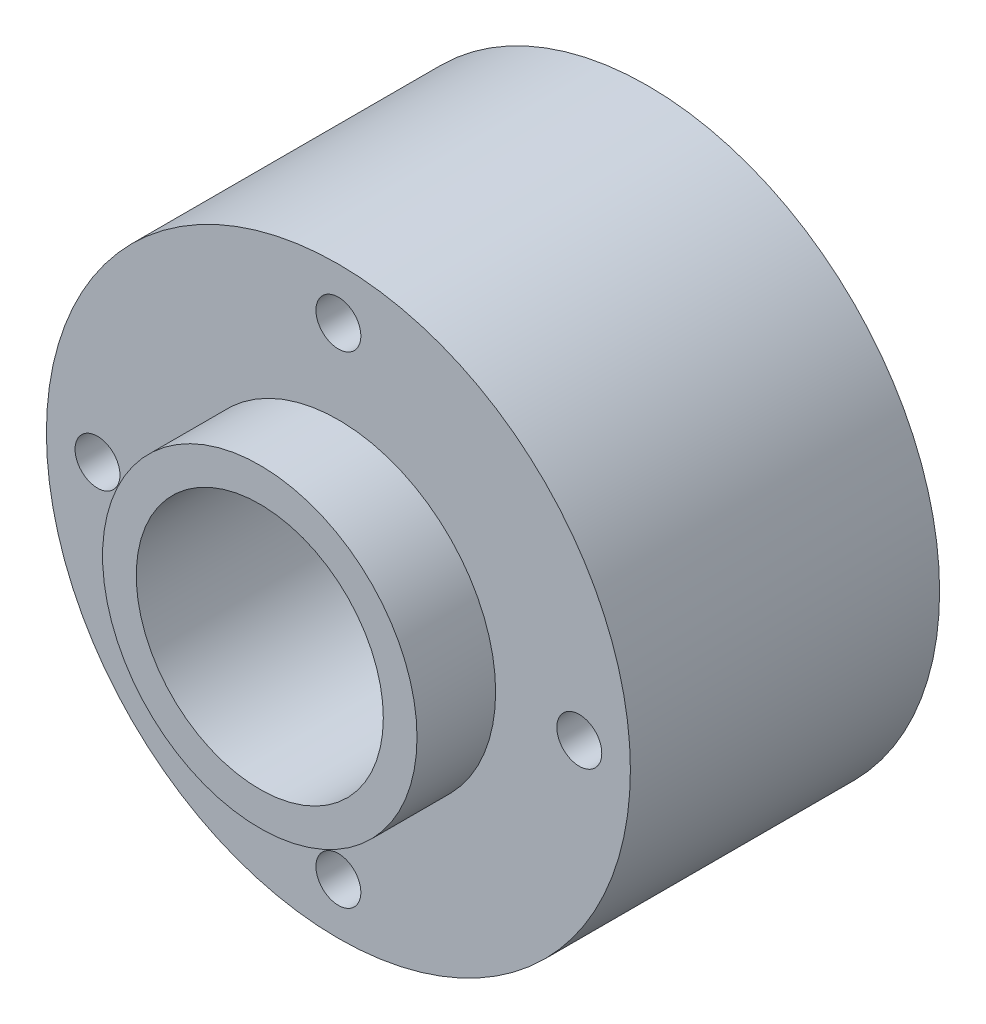
ISO-10303-21;
HEADER;
FILE_DESCRIPTION(('STEP AP214'),'2;1');
FILE_NAME('part.step','',(''),(''),'','','');
FILE_SCHEMA(('AUTOMOTIVE_DESIGN { 1 0 10303 214 1 1 1 1 }'));
ENDSEC;
DATA;
#1=APPLICATION_CONTEXT('core data for automotive mechanical design processes');
#2=APPLICATION_PROTOCOL_DEFINITION('international standard','automotive_design',2000,#1);
#3=PRODUCT_CONTEXT('',#1,'mechanical');
#4=PRODUCT('Part','Part','',(#3));
#5=PRODUCT_RELATED_PRODUCT_CATEGORY('part','',(#4));
#6=PRODUCT_DEFINITION_FORMATION('','',#4);
#7=PRODUCT_DEFINITION_CONTEXT('part definition',#1,'design');
#8=PRODUCT_DEFINITION('design','',#6,#7);
#9=PRODUCT_DEFINITION_SHAPE('','',#8);
#10=(LENGTH_UNIT() NAMED_UNIT(*) SI_UNIT(.MILLI.,.METRE.));
#11=(NAMED_UNIT(*) PLANE_ANGLE_UNIT() SI_UNIT($,.RADIAN.));
#12=(NAMED_UNIT(*) SI_UNIT($,.STERADIAN.) SOLID_ANGLE_UNIT());
#13=UNCERTAINTY_MEASURE_WITH_UNIT(LENGTH_MEASURE(1.E-05),#10,'distance_accuracy_value','');
#14=(GEOMETRIC_REPRESENTATION_CONTEXT(3) GLOBAL_UNCERTAINTY_ASSIGNED_CONTEXT((#13)) GLOBAL_UNIT_ASSIGNED_CONTEXT((#10,
#11,#12)) REPRESENTATION_CONTEXT('',''));
#15=CARTESIAN_POINT('',(0.,0.,0.));
#16=DIRECTION('',(0.,0.,1.));
#17=DIRECTION('',(1.,0.,0.));
#18=AXIS2_PLACEMENT_3D('',#15,#16,#17);
#19=CARTESIAN_POINT('',(0.,0.,-105.570645989791));
#20=DIRECTION('',(0.,0.,1.));
#21=DIRECTION('',(1.,0.,0.));
#22=AXIS2_PLACEMENT_3D('',#19,#20,#21);
#23=CYLINDRICAL_SURFACE('',#22,26.);
#24=CARTESIAN_POINT('',(0.,0.,-4.5));
#25=DIRECTION('',(0.,0.,1.));
#26=DIRECTION('',(1.,0.,0.));
#27=AXIS2_PLACEMENT_3D('',#24,#25,#26);
#28=CIRCLE('',#27,26.);
#29=CARTESIAN_POINT('',(26.,0.,-4.5));
#30=VERTEX_POINT('',#29);
#31=EDGE_CURVE('E10',#30,#30,#28,.T.);
#32=ORIENTED_EDGE('',*,*,#31,.F.);
#33=EDGE_LOOP('',(#32));
#34=FACE_BOUND('',#33,.T.);
#35=CARTESIAN_POINT('',(0.,0.,-32.0315407463901));
#36=DIRECTION('',(0.,0.,-1.));
#37=DIRECTION('',(-1.,0.,0.));
#38=AXIS2_PLACEMENT_3D('',#35,#36,#37);
#39=CIRCLE('',#38,26.);
#40=CARTESIAN_POINT('',(-26.,0.,-32.03154074639));
#41=VERTEX_POINT('',#40);
#42=EDGE_CURVE('E63',#41,#41,#39,.F.);
#43=ORIENTED_EDGE('',*,*,#42,.T.);
#44=EDGE_LOOP('',(#43));
#45=FACE_BOUND('',#44,.T.);
#46=ADVANCED_FACE('F41',(#34,#45),#23,.T.);
#47=CARTESIAN_POINT('',(21.4500000000006,5.64849035103576E-13,-105.570645989791));
#48=DIRECTION('',(0.,0.,1.));
#49=DIRECTION('',(1.,0.,0.));
#50=AXIS2_PLACEMENT_3D('',#47,#48,#49);
#51=CYLINDRICAL_SURFACE('',#50,2.);
#52=CARTESIAN_POINT('',(21.4500000000006,5.64849035103576E-13,-4.5));
#53=DIRECTION('',(0.,0.,1.));
#54=DIRECTION('',(1.,0.,0.));
#55=AXIS2_PLACEMENT_3D('',#52,#53,#54);
#56=CIRCLE('',#55,2.);
#57=CARTESIAN_POINT('',(23.4500000000006,5.64849035103576E-13,-4.5));
#58=VERTEX_POINT('',#57);
#59=EDGE_CURVE('E60',#58,#58,#56,.T.);
#60=ORIENTED_EDGE('',*,*,#59,.T.);
#61=EDGE_LOOP('',(#60));
#62=FACE_BOUND('',#61,.T.);
#63=CARTESIAN_POINT('',(21.4500000000028,-4.30060082278984E-12,-32.0315407463903));
#64=DIRECTION('',(0.,0.,-1.));
#65=DIRECTION('',(-1.,0.,0.));
#66=AXIS2_PLACEMENT_3D('',#63,#64,#65);
#67=CIRCLE('',#66,2.);
#68=CARTESIAN_POINT('',(19.4500000000028,-4.30060082278984E-12,-32.0315407463902));
#69=VERTEX_POINT('',#68);
#70=EDGE_CURVE('E45',#69,#69,#67,.T.);
#71=ORIENTED_EDGE('',*,*,#70,.T.);
#72=EDGE_LOOP('',(#71));
#73=FACE_BOUND('',#72,.T.);
#74=ADVANCED_FACE('F128',(#62,#73),#51,.F.);
#75=CARTESIAN_POINT('',(1.12969807020715E-12,-21.45,-105.570645989791));
#76=DIRECTION('',(0.,0.,1.));
#77=DIRECTION('',(1.,0.,0.));
#78=AXIS2_PLACEMENT_3D('',#75,#76,#77);
#79=CYLINDRICAL_SURFACE('',#78,2.);
#80=CARTESIAN_POINT('',(1.12969807020715E-12,-21.45,-4.5));
#81=DIRECTION('',(0.,0.,1.));
#82=DIRECTION('',(1.,0.,0.));
#83=AXIS2_PLACEMENT_3D('',#80,#81,#82);
#84=CIRCLE('',#83,2.);
#85=CARTESIAN_POINT('',(2.00000000000113,-21.45,-4.5));
#86=VERTEX_POINT('',#85);
#87=EDGE_CURVE('E64',#86,#86,#84,.T.);
#88=ORIENTED_EDGE('',*,*,#87,.T.);
#89=EDGE_LOOP('',(#88));
#90=FACE_BOUND('',#89,.T.);
#91=CARTESIAN_POINT('',(2.23985766209219E-12,-21.4500000000037,-32.0315407463901));
#92=DIRECTION('',(0.,0.,-1.));
#93=DIRECTION('',(-1.,0.,0.));
#94=AXIS2_PLACEMENT_3D('',#91,#92,#93);
#95=CIRCLE('',#94,2.);
#96=CARTESIAN_POINT('',(-1.99999999999776,-21.4500000000037,-32.0315407463901));
#97=VERTEX_POINT('',#96);
#98=EDGE_CURVE('E67',#97,#97,#95,.T.);
#99=ORIENTED_EDGE('',*,*,#98,.T.);
#100=EDGE_LOOP('',(#99));
#101=FACE_BOUND('',#100,.T.);
#102=ADVANCED_FACE('F86',(#90,#101),#79,.F.);
#103=CARTESIAN_POINT('',(-21.4499999999994,-5.67475902487747E-13,-105.570645989791));
#104=DIRECTION('',(0.,0.,1.));
#105=DIRECTION('',(1.,0.,0.));
#106=AXIS2_PLACEMENT_3D('',#103,#104,#105);
#107=CYLINDRICAL_SURFACE('',#106,2.);
#108=CARTESIAN_POINT('',(-21.4499999999994,-5.67475902487747E-13,-4.5));
#109=DIRECTION('',(0.,0.,1.));
#110=DIRECTION('',(1.,0.,0.));
#111=AXIS2_PLACEMENT_3D('',#108,#109,#110);
#112=CIRCLE('',#111,2.);
#113=CARTESIAN_POINT('',(-19.4499999999994,-5.67475902487747E-13,-4.5));
#114=VERTEX_POINT('',#113);
#115=EDGE_CURVE('E72',#114,#114,#112,.T.);
#116=ORIENTED_EDGE('',*,*,#115,.T.);
#117=EDGE_LOOP('',(#116));
#118=FACE_BOUND('',#117,.T.);
#119=CARTESIAN_POINT('',(-21.4499999999972,-3.16827588519851E-12,-32.03154074639));
#120=DIRECTION('',(0.,0.,-1.));
#121=DIRECTION('',(-1.,0.,0.));
#122=AXIS2_PLACEMENT_3D('',#119,#120,#121);
#123=CIRCLE('',#122,2.);
#124=CARTESIAN_POINT('',(-23.4499999999972,-3.16827588519851E-12,-32.03154074639));
#125=VERTEX_POINT('',#124);
#126=EDGE_CURVE('E75',#125,#125,#123,.T.);
#127=ORIENTED_EDGE('',*,*,#126,.T.);
#128=EDGE_LOOP('',(#127));
#129=FACE_BOUND('',#128,.T.);
#130=ADVANCED_FACE('F141',(#118,#129),#107,.F.);
#131=CARTESIAN_POINT('',(0.,21.45,-105.570645989791));
#132=DIRECTION('',(0.,0.,1.));
#133=DIRECTION('',(1.,0.,0.));
#134=AXIS2_PLACEMENT_3D('',#131,#132,#133);
#135=CYLINDRICAL_SURFACE('',#134,2.);
#136=CARTESIAN_POINT('',(0.,21.45,-4.5));
#137=DIRECTION('',(0.,0.,1.));
#138=DIRECTION('',(1.,0.,0.));
#139=AXIS2_PLACEMENT_3D('',#136,#137,#138);
#140=CIRCLE('',#139,2.);
#141=CARTESIAN_POINT('',(2.,21.45,-4.5));
#142=VERTEX_POINT('',#141);
#143=EDGE_CURVE('E54',#142,#142,#140,.T.);
#144=ORIENTED_EDGE('',*,*,#143,.T.);
#145=EDGE_LOOP('',(#144));
#146=FACE_BOUND('',#145,.T.);
#147=CARTESIAN_POINT('',(3.36955573229934E-12,21.4499999999963,-32.0315407463901));
#148=DIRECTION('',(0.,0.,-1.));
#149=DIRECTION('',(-1.,0.,0.));
#150=AXIS2_PLACEMENT_3D('',#147,#148,#149);
#151=CIRCLE('',#150,2.);
#152=CARTESIAN_POINT('',(-1.99999999999663,21.4499999999963,-32.0315407463901));
#153=VERTEX_POINT('',#152);
#154=EDGE_CURVE('E49',#153,#153,#151,.T.);
#155=ORIENTED_EDGE('',*,*,#154,.T.);
#156=EDGE_LOOP('',(#155));
#157=FACE_BOUND('',#156,.T.);
#158=ADVANCED_FACE('F144',(#146,#157),#135,.F.);
#159=CARTESIAN_POINT('',(0.,0.,-4.5));
#160=DIRECTION('',(0.,0.,1.));
#161=DIRECTION('',(1.,0.,0.));
#162=AXIS2_PLACEMENT_3D('',#159,#160,#161);
#163=PLANE('',#162);
#164=ORIENTED_EDGE('',*,*,#143,.F.);
#165=EDGE_LOOP('',(#164));
#166=FACE_BOUND('',#165,.T.);
#167=ORIENTED_EDGE('',*,*,#115,.F.);
#168=EDGE_LOOP('',(#167));
#169=FACE_BOUND('',#168,.T.);
#170=CARTESIAN_POINT('',(0.,0.,-4.5));
#171=DIRECTION('',(0.,0.,1.));
#172=DIRECTION('',(1.,0.,0.));
#173=AXIS2_PLACEMENT_3D('',#170,#171,#172);
#174=CIRCLE('',#173,14.);
#175=CARTESIAN_POINT('',(14.,0.,-4.5));
#176=VERTEX_POINT('',#175);
#177=EDGE_CURVE('E68',#176,#176,#174,.T.);
#178=ORIENTED_EDGE('',*,*,#177,.F.);
#179=EDGE_LOOP('',(#178));
#180=FACE_BOUND('',#179,.T.);
#181=ORIENTED_EDGE('',*,*,#87,.F.);
#182=EDGE_LOOP('',(#181));
#183=FACE_BOUND('',#182,.T.);
#184=ORIENTED_EDGE('',*,*,#59,.F.);
#185=EDGE_LOOP('',(#184));
#186=FACE_BOUND('',#185,.T.);
#187=ORIENTED_EDGE('',*,*,#31,.T.);
#188=EDGE_LOOP('',(#187));
#189=FACE_BOUND('',#188,.T.);
#190=ADVANCED_FACE('F91',(#166,#169,#180,#183,#186,#189),#163,.T.);
#191=CARTESIAN_POINT('',(-13.4999999999966,37.4999999999963,-32.03154074639));
#192=DIRECTION('',(0.,0.,-1.));
#193=DIRECTION('',(-1.,0.,0.));
#194=AXIS2_PLACEMENT_3D('',#191,#192,#193);
#195=PLANE('',#194);
#196=ORIENTED_EDGE('',*,*,#42,.F.);
#197=EDGE_LOOP('',(#196));
#198=FACE_BOUND('',#197,.T.);
#199=ORIENTED_EDGE('',*,*,#70,.F.);
#200=EDGE_LOOP('',(#199));
#201=FACE_BOUND('',#200,.T.);
#202=ORIENTED_EDGE('',*,*,#98,.F.);
#203=EDGE_LOOP('',(#202));
#204=FACE_BOUND('',#203,.T.);
#205=ORIENTED_EDGE('',*,*,#126,.F.);
#206=EDGE_LOOP('',(#205));
#207=FACE_BOUND('',#206,.T.);
#208=ORIENTED_EDGE('',*,*,#154,.F.);
#209=EDGE_LOOP('',(#208));
#210=FACE_BOUND('',#209,.T.);
#211=CARTESIAN_POINT('',(3.36955573229934E-12,-3.73312492030209E-12,-32.0315407463901));
#212=DIRECTION('',(0.,0.,-1.));
#213=DIRECTION('',(-1.,0.,0.));
#214=AXIS2_PLACEMENT_3D('',#211,#212,#213);
#215=CIRCLE('',#214,14.);
#216=CARTESIAN_POINT('',(-13.9999999999966,-3.73312492030209E-12,-32.03154074639));
#217=VERTEX_POINT('',#216);
#218=EDGE_CURVE('E71',#217,#217,#215,.T.);
#219=ORIENTED_EDGE('',*,*,#218,.F.);
#220=EDGE_LOOP('',(#219));
#221=FACE_BOUND('',#220,.T.);
#222=ADVANCED_FACE('F43',(#198,#201,#204,#207,#210,#221),#195,.T.);
#223=CARTESIAN_POINT('',(0.,0.,2.5));
#224=DIRECTION('',(0.,0.,-1.));
#225=DIRECTION('',(-1.,0.,0.));
#226=AXIS2_PLACEMENT_3D('',#223,#224,#225);
#227=CYLINDRICAL_SURFACE('',#226,14.);
#228=ORIENTED_EDGE('',*,*,#177,.T.);
#229=EDGE_LOOP('',(#228));
#230=FACE_BOUND('',#229,.T.);
#231=CARTESIAN_POINT('',(0.,0.,2.5));
#232=DIRECTION('',(0.,0.,1.));
#233=DIRECTION('',(1.,0.,0.));
#234=AXIS2_PLACEMENT_3D('',#231,#232,#233);
#235=CIRCLE('',#234,14.);
#236=CARTESIAN_POINT('',(14.,0.,2.5));
#237=VERTEX_POINT('',#236);
#238=EDGE_CURVE('E58',#237,#237,#235,.T.);
#239=ORIENTED_EDGE('',*,*,#238,.F.);
#240=EDGE_LOOP('',(#239));
#241=FACE_BOUND('',#240,.T.);
#242=ADVANCED_FACE('F90',(#230,#241),#227,.T.);
#243=CARTESIAN_POINT('',(0.,0.,2.5));
#244=DIRECTION('',(0.,0.,1.));
#245=DIRECTION('',(1.,0.,0.));
#246=AXIS2_PLACEMENT_3D('',#243,#244,#245);
#247=PLANE('',#246);
#248=ORIENTED_EDGE('',*,*,#238,.T.);
#249=EDGE_LOOP('',(#248));
#250=FACE_BOUND('',#249,.T.);
#251=CARTESIAN_POINT('',(0.,0.,2.5));
#252=DIRECTION('',(0.,0.,1.));
#253=DIRECTION('',(1.,0.,0.));
#254=AXIS2_PLACEMENT_3D('',#251,#252,#253);
#255=CIRCLE('',#254,11.);
#256=CARTESIAN_POINT('',(11.,0.,2.5));
#257=VERTEX_POINT('',#256);
#258=EDGE_CURVE('E109',#257,#257,#255,.T.);
#259=ORIENTED_EDGE('',*,*,#258,.F.);
#260=EDGE_LOOP('',(#259));
#261=FACE_BOUND('',#260,.T.);
#262=ADVANCED_FACE('F103',(#250,#261),#247,.T.);
#263=ORIENTED_EDGE('',*,*,#218,.T.);
#264=EDGE_LOOP('',(#263));
#265=FACE_BOUND('',#264,.T.);
#266=CARTESIAN_POINT('',(0.,0.,-38.5));
#267=DIRECTION('',(0.,0.,1.));
#268=DIRECTION('',(1.,0.,0.));
#269=AXIS2_PLACEMENT_3D('',#266,#267,#268);
#270=CIRCLE('',#269,14.);
#271=CARTESIAN_POINT('',(14.,0.,-38.5));
#272=VERTEX_POINT('',#271);
#273=EDGE_CURVE('E107',#272,#272,#270,.T.);
#274=ORIENTED_EDGE('',*,*,#273,.T.);
#275=EDGE_LOOP('',(#274));
#276=FACE_BOUND('',#275,.T.);
#277=ADVANCED_FACE('F99',(#265,#276),#227,.T.);
#278=CARTESIAN_POINT('',(0.,0.,2.5));
#279=DIRECTION('',(0.,0.,-1.));
#280=DIRECTION('',(-1.,0.,0.));
#281=AXIS2_PLACEMENT_3D('',#278,#279,#280);
#282=CYLINDRICAL_SURFACE('',#281,11.);
#283=ORIENTED_EDGE('',*,*,#258,.T.);
#284=EDGE_LOOP('',(#283));
#285=FACE_BOUND('',#284,.T.);
#286=CARTESIAN_POINT('',(0.,0.,-38.5));
#287=DIRECTION('',(0.,0.,1.));
#288=DIRECTION('',(1.,0.,0.));
#289=AXIS2_PLACEMENT_3D('',#286,#287,#288);
#290=CIRCLE('',#289,11.);
#291=CARTESIAN_POINT('',(11.,0.,-38.5));
#292=VERTEX_POINT('',#291);
#293=EDGE_CURVE('E110',#292,#292,#290,.T.);
#294=ORIENTED_EDGE('',*,*,#293,.F.);
#295=EDGE_LOOP('',(#294));
#296=FACE_BOUND('',#295,.T.);
#297=ADVANCED_FACE('F102',(#285,#296),#282,.F.);
#298=CARTESIAN_POINT('',(0.,0.,-38.5));
#299=DIRECTION('',(0.,0.,1.));
#300=DIRECTION('',(1.,0.,0.));
#301=AXIS2_PLACEMENT_3D('',#298,#299,#300);
#302=PLANE('',#301);
#303=ORIENTED_EDGE('',*,*,#293,.T.);
#304=EDGE_LOOP('',(#303));
#305=FACE_BOUND('',#304,.T.);
#306=ORIENTED_EDGE('',*,*,#273,.F.);
#307=EDGE_LOOP('',(#306));
#308=FACE_BOUND('',#307,.T.);
#309=ADVANCED_FACE('F117',(#305,#308),#302,.F.);
#310=CLOSED_SHELL('',(#46,#74,#102,#130,#158,#190,#222,#242,#262,#277,#297,#309));
#311=MANIFOLD_SOLID_BREP('B2',#310);
#312=ADVANCED_BREP_SHAPE_REPRESENTATION('',(#18,#311),#14);
#313=SHAPE_DEFINITION_REPRESENTATION(#9,#312);
ENDSEC;
END-ISO-10303-21;
